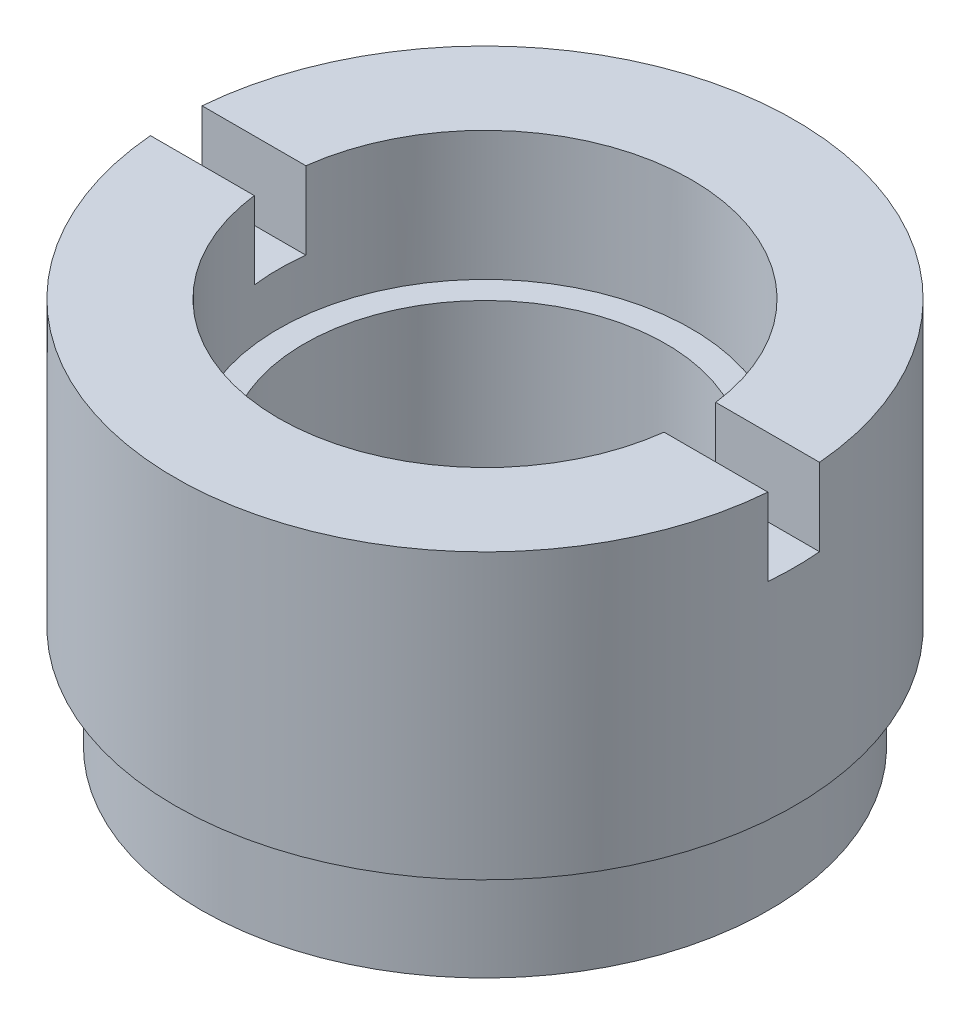
ISO-10303-21;
HEADER;
FILE_DESCRIPTION(('STEP AP214'),'2;1');
FILE_NAME('part.step','',(''),(''),'','','');
FILE_SCHEMA(('AUTOMOTIVE_DESIGN { 1 0 10303 214 1 1 1 1 }'));
ENDSEC;
DATA;
#1=APPLICATION_CONTEXT('core data for automotive mechanical design processes');
#2=APPLICATION_PROTOCOL_DEFINITION('international standard','automotive_design',2000,#1);
#3=PRODUCT_CONTEXT('',#1,'mechanical');
#4=PRODUCT('Part','Part','',(#3));
#5=PRODUCT_RELATED_PRODUCT_CATEGORY('part','',(#4));
#6=PRODUCT_DEFINITION_FORMATION('','',#4);
#7=PRODUCT_DEFINITION_CONTEXT('part definition',#1,'design');
#8=PRODUCT_DEFINITION('design','',#6,#7);
#9=PRODUCT_DEFINITION_SHAPE('','',#8);
#10=(LENGTH_UNIT() NAMED_UNIT(*) SI_UNIT(.MILLI.,.METRE.));
#11=(NAMED_UNIT(*) PLANE_ANGLE_UNIT() SI_UNIT($,.RADIAN.));
#12=(NAMED_UNIT(*) SI_UNIT($,.STERADIAN.) SOLID_ANGLE_UNIT());
#13=UNCERTAINTY_MEASURE_WITH_UNIT(LENGTH_MEASURE(1.E-05),#10,'distance_accuracy_value','');
#14=(GEOMETRIC_REPRESENTATION_CONTEXT(3) GLOBAL_UNCERTAINTY_ASSIGNED_CONTEXT((#13)) GLOBAL_UNIT_ASSIGNED_CONTEXT((#10,
#11,#12)) REPRESENTATION_CONTEXT('',''));
#15=CARTESIAN_POINT('',(0.,0.,0.));
#16=DIRECTION('',(0.,0.,1.));
#17=DIRECTION('',(1.,0.,0.));
#18=AXIS2_PLACEMENT_3D('',#15,#16,#17);
#19=CARTESIAN_POINT('',(0.,8.,0.));
#20=DIRECTION('',(0.,-1.,0.));
#21=DIRECTION('',(0.,0.,-1.));
#22=AXIS2_PLACEMENT_3D('',#19,#20,#21);
#23=PLANE('',#22);
#24=DIRECTION('',(-1.,0.,0.));
#25=VECTOR('',#24,1.);
#26=CARTESIAN_POINT('',(-19.7522842639594,8.,-1.));
#27=LINE('',#26,#25);
#28=CARTESIAN_POINT('',(11.9582607431014,8.,-1.));
#29=VERTEX_POINT('',#28);
#30=CARTESIAN_POINT('',(7.93725393319377,8.,-1.));
#31=VERTEX_POINT('',#30);
#32=EDGE_CURVE('E125',#29,#31,#27,.T.);
#33=ORIENTED_EDGE('',*,*,#32,.T.);
#34=CARTESIAN_POINT('',(0.,8.,0.));
#35=DIRECTION('',(0.,-1.,0.));
#36=DIRECTION('',(0.,0.,-1.));
#37=AXIS2_PLACEMENT_3D('',#34,#35,#36);
#38=CIRCLE('',#37,8.);
#39=CARTESIAN_POINT('',(7.93725393319377,8.,1.));
#40=VERTEX_POINT('',#39);
#41=EDGE_CURVE('E32',#31,#40,#38,.T.);
#42=ORIENTED_EDGE('',*,*,#41,.T.);
#43=DIRECTION('',(1.,0.,0.));
#44=VECTOR('',#43,1.);
#45=CARTESIAN_POINT('',(-19.7522842639594,8.,1.));
#46=LINE('',#45,#44);
#47=CARTESIAN_POINT('',(11.9582607431014,8.,1.));
#48=VERTEX_POINT('',#47);
#49=EDGE_CURVE('E101',#40,#48,#46,.T.);
#50=ORIENTED_EDGE('',*,*,#49,.T.);
#51=CARTESIAN_POINT('',(0.,8.,0.));
#52=DIRECTION('',(0.,-1.,0.));
#53=DIRECTION('',(0.,0.,-1.));
#54=AXIS2_PLACEMENT_3D('',#51,#52,#53);
#55=CIRCLE('',#54,12.);
#56=EDGE_CURVE('E117',#29,#48,#55,.T.);
#57=ORIENTED_EDGE('',*,*,#56,.F.);
#58=EDGE_LOOP('',(#33,#42,#50,#57));
#59=FACE_BOUND('',#58,.T.);
#60=ADVANCED_FACE('F17',(#59),#23,.F.);
#61=CARTESIAN_POINT('',(-19.7522842639594,8.,1.));
#62=DIRECTION('',(0.,0.,1.));
#63=DIRECTION('',(1.,0.,0.));
#64=AXIS2_PLACEMENT_3D('',#61,#62,#63);
#65=PLANE('',#64);
#66=ORIENTED_EDGE('',*,*,#49,.F.);
#67=DIRECTION('',(0.,1.,0.));
#68=VECTOR('',#67,1.);
#69=CARTESIAN_POINT('',(7.93725393319377,6.,1.));
#70=LINE('',#69,#68);
#71=CARTESIAN_POINT('',(7.93725393319377,11.,1.));
#72=VERTEX_POINT('',#71);
#73=EDGE_CURVE('E85',#40,#72,#70,.T.);
#74=ORIENTED_EDGE('',*,*,#73,.T.);
#75=DIRECTION('',(1.,0.,0.));
#76=VECTOR('',#75,1.);
#77=CARTESIAN_POINT('',(0.,11.,1.));
#78=LINE('',#77,#76);
#79=CARTESIAN_POINT('',(11.9582607431014,11.,1.));
#80=VERTEX_POINT('',#79);
#81=EDGE_CURVE('E99',#72,#80,#78,.T.);
#82=ORIENTED_EDGE('',*,*,#81,.T.);
#83=DIRECTION('',(0.,-1.,0.));
#84=VECTOR('',#83,1.);
#85=CARTESIAN_POINT('',(11.9582607431014,11.,1.));
#86=LINE('',#85,#84);
#87=EDGE_CURVE('E122',#48,#80,#86,.F.);
#88=ORIENTED_EDGE('',*,*,#87,.F.);
#89=EDGE_LOOP('',(#66,#74,#82,#88));
#90=FACE_BOUND('',#89,.T.);
#91=ADVANCED_FACE('F97',(#90),#65,.F.);
#92=CARTESIAN_POINT('',(-19.7522842639594,8.,-1.));
#93=DIRECTION('',(0.,0.,-1.));
#94=DIRECTION('',(-1.,0.,0.));
#95=AXIS2_PLACEMENT_3D('',#92,#93,#94);
#96=PLANE('',#95);
#97=CARTESIAN_POINT('',(-7.93725393319377,8.,-1.));
#98=VERTEX_POINT('',#97);
#99=CARTESIAN_POINT('',(-11.9582607431014,8.,-1.));
#100=VERTEX_POINT('',#99);
#101=EDGE_CURVE('E127',#98,#100,#27,.T.);
#102=ORIENTED_EDGE('',*,*,#101,.F.);
#103=DIRECTION('',(0.,1.,0.));
#104=VECTOR('',#103,1.);
#105=CARTESIAN_POINT('',(-7.93725393319377,6.,-1.));
#106=LINE('',#105,#104);
#107=CARTESIAN_POINT('',(-7.93725393319377,11.,-1.));
#108=VERTEX_POINT('',#107);
#109=EDGE_CURVE('E11',#98,#108,#106,.T.);
#110=ORIENTED_EDGE('',*,*,#109,.T.);
#111=DIRECTION('',(-1.,0.,0.));
#112=VECTOR('',#111,1.);
#113=CARTESIAN_POINT('',(0.,11.,-1.));
#114=LINE('',#113,#112);
#115=CARTESIAN_POINT('',(-11.9582607431014,11.,-1.));
#116=VERTEX_POINT('',#115);
#117=EDGE_CURVE('E112',#108,#116,#114,.T.);
#118=ORIENTED_EDGE('',*,*,#117,.T.);
#119=DIRECTION('',(0.,-1.,0.));
#120=VECTOR('',#119,1.);
#121=CARTESIAN_POINT('',(-11.9582607431014,11.,-1.));
#122=LINE('',#121,#120);
#123=EDGE_CURVE('E134',#100,#116,#122,.F.);
#124=ORIENTED_EDGE('',*,*,#123,.F.);
#125=EDGE_LOOP('',(#102,#110,#118,#124));
#126=FACE_BOUND('',#125,.T.);
#127=ADVANCED_FACE('F161',(#126),#96,.F.);
#128=CARTESIAN_POINT('',(0.,11.,0.));
#129=DIRECTION('',(0.,1.,0.));
#130=DIRECTION('',(0.,0.,1.));
#131=AXIS2_PLACEMENT_3D('',#128,#129,#130);
#132=PLANE('',#131);
#133=CARTESIAN_POINT('',(0.,11.,0.));
#134=DIRECTION('',(0.,1.,0.));
#135=DIRECTION('',(0.,0.,1.));
#136=AXIS2_PLACEMENT_3D('',#133,#134,#135);
#137=CIRCLE('',#136,8.);
#138=CARTESIAN_POINT('',(-7.93725393319377,11.,1.));
#139=VERTEX_POINT('',#138);
#140=EDGE_CURVE('E82',#139,#72,#137,.T.);
#141=ORIENTED_EDGE('',*,*,#140,.F.);
#142=CARTESIAN_POINT('',(-11.9582607431014,11.,1.));
#143=VERTEX_POINT('',#142);
#144=EDGE_CURVE('E108',#143,#139,#78,.T.);
#145=ORIENTED_EDGE('',*,*,#144,.F.);
#146=CARTESIAN_POINT('',(0.,11.,0.));
#147=DIRECTION('',(0.,1.,0.));
#148=DIRECTION('',(0.,0.,1.));
#149=AXIS2_PLACEMENT_3D('',#146,#147,#148);
#150=CIRCLE('',#149,12.);
#151=EDGE_CURVE('E107',#143,#80,#150,.T.);
#152=ORIENTED_EDGE('',*,*,#151,.T.);
#153=ORIENTED_EDGE('',*,*,#81,.F.);
#154=EDGE_LOOP('',(#141,#145,#152,#153));
#155=FACE_BOUND('',#154,.T.);
#156=ADVANCED_FACE('F105',(#155),#132,.T.);
#157=CARTESIAN_POINT('',(0.,11.,0.));
#158=DIRECTION('',(0.,-1.,0.));
#159=DIRECTION('',(0.,0.,-1.));
#160=AXIS2_PLACEMENT_3D('',#157,#158,#159);
#161=CYLINDRICAL_SURFACE('',#160,12.);
#162=ORIENTED_EDGE('',*,*,#56,.T.);
#163=ORIENTED_EDGE('',*,*,#87,.T.);
#164=ORIENTED_EDGE('',*,*,#151,.F.);
#165=DIRECTION('',(0.,-1.,0.));
#166=VECTOR('',#165,1.);
#167=CARTESIAN_POINT('',(-11.9582607431014,11.,1.));
#168=LINE('',#167,#166);
#169=CARTESIAN_POINT('',(-11.9582607431014,8.,1.));
#170=VERTEX_POINT('',#169);
#171=EDGE_CURVE('E139',#143,#170,#168,.T.);
#172=ORIENTED_EDGE('',*,*,#171,.T.);
#173=EDGE_CURVE('E111',#170,#100,#55,.T.);
#174=ORIENTED_EDGE('',*,*,#173,.T.);
#175=ORIENTED_EDGE('',*,*,#123,.T.);
#176=CARTESIAN_POINT('',(11.9582607431014,11.,-1.));
#177=VERTEX_POINT('',#176);
#178=EDGE_CURVE('E147',#177,#116,#150,.T.);
#179=ORIENTED_EDGE('',*,*,#178,.F.);
#180=DIRECTION('',(0.,-1.,0.));
#181=VECTOR('',#180,1.);
#182=CARTESIAN_POINT('',(11.9582607431014,11.,-1.));
#183=LINE('',#182,#181);
#184=EDGE_CURVE('E40',#177,#29,#183,.T.);
#185=ORIENTED_EDGE('',*,*,#184,.T.);
#186=EDGE_LOOP('',(#162,#163,#164,#172,#174,#175,#179,#185));
#187=FACE_BOUND('',#186,.T.);
#188=CARTESIAN_POINT('',(0.,0.,0.));
#189=DIRECTION('',(0.,1.,0.));
#190=DIRECTION('',(0.,0.,1.));
#191=AXIS2_PLACEMENT_3D('',#188,#189,#190);
#192=CIRCLE('',#191,12.);
#193=CARTESIAN_POINT('',(0.,0.,12.));
#194=VERTEX_POINT('',#193);
#195=EDGE_CURVE('E145',#194,#194,#192,.T.);
#196=ORIENTED_EDGE('',*,*,#195,.T.);
#197=EDGE_LOOP('',(#196));
#198=FACE_BOUND('',#197,.T.);
#199=ADVANCED_FACE('F19',(#187,#198),#161,.T.);
#200=CARTESIAN_POINT('',(7.93725393319377,11.,-1.));
#201=VERTEX_POINT('',#200);
#202=EDGE_CURVE('E92',#201,#108,#137,.T.);
#203=ORIENTED_EDGE('',*,*,#202,.F.);
#204=EDGE_CURVE('E109',#177,#201,#114,.T.);
#205=ORIENTED_EDGE('',*,*,#204,.F.);
#206=ORIENTED_EDGE('',*,*,#178,.T.);
#207=ORIENTED_EDGE('',*,*,#117,.F.);
#208=EDGE_LOOP('',(#203,#205,#206,#207));
#209=FACE_BOUND('',#208,.T.);
#210=ADVANCED_FACE('F157',(#209),#132,.T.);
#211=CARTESIAN_POINT('',(0.,0.,0.));
#212=DIRECTION('',(0.,1.,0.));
#213=DIRECTION('',(0.,0.,1.));
#214=AXIS2_PLACEMENT_3D('',#211,#212,#213);
#215=PLANE('',#214);
#216=CARTESIAN_POINT('',(0.,0.,0.));
#217=DIRECTION('',(0.,1.,0.));
#218=DIRECTION('',(0.,0.,1.));
#219=AXIS2_PLACEMENT_3D('',#216,#217,#218);
#220=CIRCLE('',#219,11.);
#221=CARTESIAN_POINT('',(0.,0.,11.));
#222=VERTEX_POINT('',#221);
#223=EDGE_CURVE('E149',#222,#222,#220,.F.);
#224=ORIENTED_EDGE('',*,*,#223,.F.);
#225=EDGE_LOOP('',(#224));
#226=FACE_BOUND('',#225,.T.);
#227=ORIENTED_EDGE('',*,*,#195,.F.);
#228=EDGE_LOOP('',(#227));
#229=FACE_BOUND('',#228,.T.);
#230=ADVANCED_FACE('F213',(#226,#229),#215,.F.);
#231=CARTESIAN_POINT('',(0.,-4.,0.));
#232=DIRECTION('',(0.,1.,0.));
#233=DIRECTION('',(0.,0.,1.));
#234=AXIS2_PLACEMENT_3D('',#231,#232,#233);
#235=CYLINDRICAL_SURFACE('',#234,11.);
#236=CARTESIAN_POINT('',(0.,-4.,0.));
#237=DIRECTION('',(0.,-1.,0.));
#238=DIRECTION('',(0.,0.,-1.));
#239=AXIS2_PLACEMENT_3D('',#236,#237,#238);
#240=CIRCLE('',#239,11.);
#241=CARTESIAN_POINT('',(0.,-4.,-11.));
#242=VERTEX_POINT('',#241);
#243=EDGE_CURVE('E142',#242,#242,#240,.T.);
#244=ORIENTED_EDGE('',*,*,#243,.F.);
#245=EDGE_LOOP('',(#244));
#246=FACE_BOUND('',#245,.T.);
#247=ORIENTED_EDGE('',*,*,#223,.T.);
#248=EDGE_LOOP('',(#247));
#249=FACE_BOUND('',#248,.T.);
#250=ADVANCED_FACE('F207',(#246,#249),#235,.T.);
#251=CARTESIAN_POINT('',(0.,-4.,0.));
#252=DIRECTION('',(0.,-1.,0.));
#253=DIRECTION('',(0.,0.,-1.));
#254=AXIS2_PLACEMENT_3D('',#251,#252,#253);
#255=PLANE('',#254);
#256=CARTESIAN_POINT('',(0.,-4.,0.));
#257=DIRECTION('',(0.,-1.,0.));
#258=DIRECTION('',(0.,0.,-1.));
#259=AXIS2_PLACEMENT_3D('',#256,#257,#258);
#260=CIRCLE('',#259,7.);
#261=CARTESIAN_POINT('',(0.,-4.,-7.));
#262=VERTEX_POINT('',#261);
#263=EDGE_CURVE('E93',#262,#262,#260,.T.);
#264=ORIENTED_EDGE('',*,*,#263,.F.);
#265=EDGE_LOOP('',(#264));
#266=FACE_BOUND('',#265,.T.);
#267=ORIENTED_EDGE('',*,*,#243,.T.);
#268=EDGE_LOOP('',(#267));
#269=FACE_BOUND('',#268,.T.);
#270=ADVANCED_FACE('F201',(#266,#269),#255,.T.);
#271=CARTESIAN_POINT('',(-7.93725393319377,8.,1.));
#272=VERTEX_POINT('',#271);
#273=EDGE_CURVE('E129',#170,#272,#46,.T.);
#274=ORIENTED_EDGE('',*,*,#273,.T.);
#275=EDGE_CURVE('E102',#272,#98,#38,.T.);
#276=ORIENTED_EDGE('',*,*,#275,.T.);
#277=ORIENTED_EDGE('',*,*,#101,.T.);
#278=ORIENTED_EDGE('',*,*,#173,.F.);
#279=EDGE_LOOP('',(#274,#276,#277,#278));
#280=FACE_BOUND('',#279,.T.);
#281=ADVANCED_FACE('F164',(#280),#23,.F.);
#282=ORIENTED_EDGE('',*,*,#144,.T.);
#283=DIRECTION('',(0.,1.,0.));
#284=VECTOR('',#283,1.);
#285=CARTESIAN_POINT('',(-7.93725393319377,6.,1.));
#286=LINE('',#285,#284);
#287=EDGE_CURVE('E87',#139,#272,#286,.F.);
#288=ORIENTED_EDGE('',*,*,#287,.T.);
#289=ORIENTED_EDGE('',*,*,#273,.F.);
#290=ORIENTED_EDGE('',*,*,#171,.F.);
#291=EDGE_LOOP('',(#282,#288,#289,#290));
#292=FACE_BOUND('',#291,.T.);
#293=ADVANCED_FACE('F199',(#292),#65,.F.);
#294=ORIENTED_EDGE('',*,*,#204,.T.);
#295=DIRECTION('',(0.,1.,0.));
#296=VECTOR('',#295,1.);
#297=CARTESIAN_POINT('',(7.93725393319377,6.,-1.));
#298=LINE('',#297,#296);
#299=EDGE_CURVE('E25',#201,#31,#298,.F.);
#300=ORIENTED_EDGE('',*,*,#299,.T.);
#301=ORIENTED_EDGE('',*,*,#32,.F.);
#302=ORIENTED_EDGE('',*,*,#184,.F.);
#303=EDGE_LOOP('',(#294,#300,#301,#302));
#304=FACE_BOUND('',#303,.T.);
#305=ADVANCED_FACE('F126',(#304),#96,.F.);
#306=CARTESIAN_POINT('',(0.,6.,0.));
#307=DIRECTION('',(0.,1.,0.));
#308=DIRECTION('',(0.,0.,1.));
#309=AXIS2_PLACEMENT_3D('',#306,#307,#308);
#310=CYLINDRICAL_SURFACE('',#309,8.);
#311=CARTESIAN_POINT('',(0.,6.,0.));
#312=DIRECTION('',(0.,1.,0.));
#313=DIRECTION('',(0.,0.,1.));
#314=AXIS2_PLACEMENT_3D('',#311,#312,#313);
#315=CIRCLE('',#314,8.);
#316=CARTESIAN_POINT('',(0.,6.,8.));
#317=VERTEX_POINT('',#316);
#318=EDGE_CURVE('E167',#317,#317,#315,.T.);
#319=ORIENTED_EDGE('',*,*,#318,.F.);
#320=EDGE_LOOP('',(#319));
#321=FACE_BOUND('',#320,.T.);
#322=ORIENTED_EDGE('',*,*,#140,.T.);
#323=ORIENTED_EDGE('',*,*,#73,.F.);
#324=ORIENTED_EDGE('',*,*,#41,.F.);
#325=ORIENTED_EDGE('',*,*,#299,.F.);
#326=ORIENTED_EDGE('',*,*,#202,.T.);
#327=ORIENTED_EDGE('',*,*,#109,.F.);
#328=ORIENTED_EDGE('',*,*,#275,.F.);
#329=ORIENTED_EDGE('',*,*,#287,.F.);
#330=EDGE_LOOP('',(#322,#323,#324,#325,#326,#327,#328,#329));
#331=FACE_BOUND('',#330,.T.);
#332=ADVANCED_FACE('F84',(#321,#331),#310,.F.);
#333=CARTESIAN_POINT('',(0.,6.,0.));
#334=DIRECTION('',(0.,1.,0.));
#335=DIRECTION('',(0.,0.,1.));
#336=AXIS2_PLACEMENT_3D('',#333,#334,#335);
#337=PLANE('',#336);
#338=CARTESIAN_POINT('',(0.,6.,0.));
#339=DIRECTION('',(0.,1.,0.));
#340=DIRECTION('',(0.,0.,1.));
#341=AXIS2_PLACEMENT_3D('',#338,#339,#340);
#342=CIRCLE('',#341,7.);
#343=CARTESIAN_POINT('',(0.,6.,7.));
#344=VERTEX_POINT('',#343);
#345=EDGE_CURVE('E175',#344,#344,#342,.T.);
#346=ORIENTED_EDGE('',*,*,#345,.F.);
#347=EDGE_LOOP('',(#346));
#348=FACE_BOUND('',#347,.T.);
#349=ORIENTED_EDGE('',*,*,#318,.T.);
#350=EDGE_LOOP('',(#349));
#351=FACE_BOUND('',#350,.T.);
#352=ADVANCED_FACE('F181',(#348,#351),#337,.T.);
#353=CARTESIAN_POINT('',(0.,-14.,0.));
#354=DIRECTION('',(0.,1.,0.));
#355=DIRECTION('',(0.,0.,1.));
#356=AXIS2_PLACEMENT_3D('',#353,#354,#355);
#357=CYLINDRICAL_SURFACE('',#356,7.);
#358=ORIENTED_EDGE('',*,*,#263,.T.);
#359=EDGE_LOOP('',(#358));
#360=FACE_BOUND('',#359,.T.);
#361=ORIENTED_EDGE('',*,*,#345,.T.);
#362=EDGE_LOOP('',(#361));
#363=FACE_BOUND('',#362,.T.);
#364=ADVANCED_FACE('F179',(#360,#363),#357,.F.);
#365=CLOSED_SHELL('',(#60,#91,#127,#156,#199,#210,#230,#250,#270,#281,#293,#305,#332,#352,#364));
#366=MANIFOLD_SOLID_BREP('B1',#365);
#367=ADVANCED_BREP_SHAPE_REPRESENTATION('',(#18,#366),#14);
#368=SHAPE_DEFINITION_REPRESENTATION(#9,#367);
ENDSEC;
END-ISO-10303-21;
